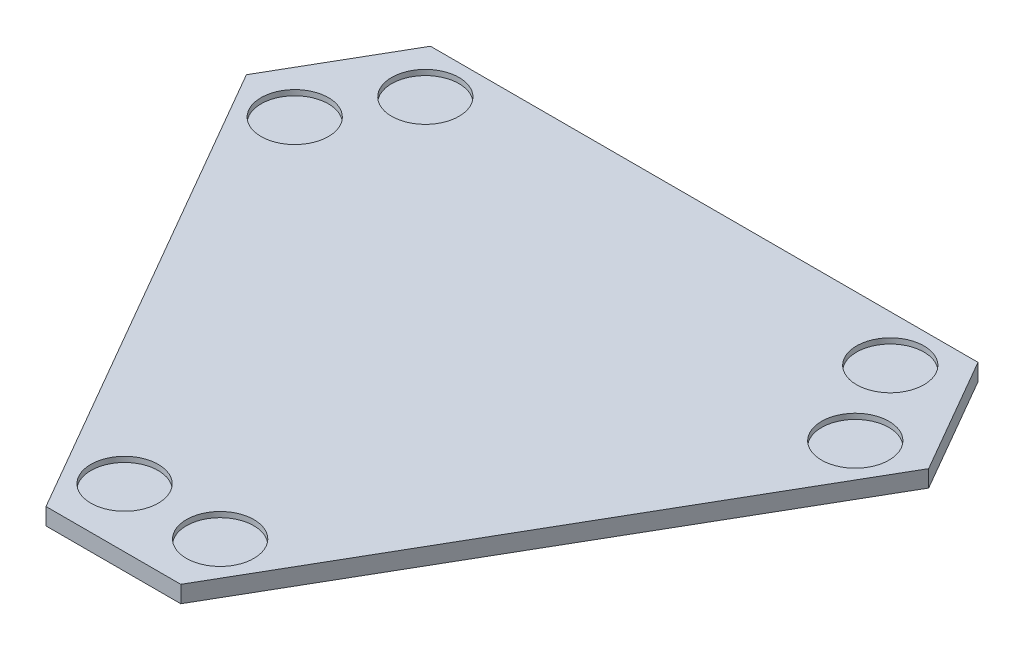
ISO-10303-21;
HEADER;
FILE_DESCRIPTION(('STEP AP214'),'2;1');
FILE_NAME('part.step','',(''),(''),'','','');
FILE_SCHEMA(('AUTOMOTIVE_DESIGN { 1 0 10303 214 1 1 1 1 }'));
ENDSEC;
DATA;
#1=APPLICATION_CONTEXT('core data for automotive mechanical design processes');
#2=APPLICATION_PROTOCOL_DEFINITION('international standard','automotive_design',2000,#1);
#3=PRODUCT_CONTEXT('',#1,'mechanical');
#4=PRODUCT('Part','Part','',(#3));
#5=PRODUCT_RELATED_PRODUCT_CATEGORY('part','',(#4));
#6=PRODUCT_DEFINITION_FORMATION('','',#4);
#7=PRODUCT_DEFINITION_CONTEXT('part definition',#1,'design');
#8=PRODUCT_DEFINITION('design','',#6,#7);
#9=PRODUCT_DEFINITION_SHAPE('','',#8);
#10=(LENGTH_UNIT() NAMED_UNIT(*) SI_UNIT(.MILLI.,.METRE.));
#11=(NAMED_UNIT(*) PLANE_ANGLE_UNIT() SI_UNIT($,.RADIAN.));
#12=(NAMED_UNIT(*) SI_UNIT($,.STERADIAN.) SOLID_ANGLE_UNIT());
#13=UNCERTAINTY_MEASURE_WITH_UNIT(LENGTH_MEASURE(1.E-05),#10,'distance_accuracy_value','');
#14=(GEOMETRIC_REPRESENTATION_CONTEXT(3) GLOBAL_UNCERTAINTY_ASSIGNED_CONTEXT((#13)) GLOBAL_UNIT_ASSIGNED_CONTEXT((#10,
#11,#12)) REPRESENTATION_CONTEXT('',''));
#15=CARTESIAN_POINT('',(0.,0.,0.));
#16=DIRECTION('',(0.,0.,1.));
#17=DIRECTION('',(1.,0.,0.));
#18=AXIS2_PLACEMENT_3D('',#15,#16,#17);
#19=CARTESIAN_POINT('',(60.6217782649107,5.,35.));
#20=DIRECTION('',(0.866025403784439,0.,0.5));
#21=DIRECTION('',(0.5,0.,-0.866025403784439));
#22=AXIS2_PLACEMENT_3D('',#19,#20,#21);
#23=PLANE('',#22);
#24=DIRECTION('',(-0.5,0.,0.866025403784439));
#25=VECTOR('',#24,1.);
#26=CARTESIAN_POINT('',(60.6217782649107,0.,35.));
#27=LINE('',#26,#25);
#28=CARTESIAN_POINT('',(101.243556529821,0.,-35.3589838486224));
#29=VERTEX_POINT('',#28);
#30=CARTESIAN_POINT('',(20.0000000000001,0.,105.358983848622));
#31=VERTEX_POINT('',#30);
#32=EDGE_CURVE('E164',#29,#31,#27,.T.);
#33=ORIENTED_EDGE('',*,*,#32,.F.);
#34=DIRECTION('',(0.,-1.,0.));
#35=VECTOR('',#34,1.);
#36=CARTESIAN_POINT('',(101.243556529821,5.,-35.3589838486224));
#37=LINE('',#36,#35);
#38=CARTESIAN_POINT('',(101.243556529821,5.,-35.3589838486224));
#39=VERTEX_POINT('',#38);
#40=EDGE_CURVE('E89',#39,#29,#37,.T.);
#41=ORIENTED_EDGE('',*,*,#40,.F.);
#42=DIRECTION('',(-0.5,0.,0.866025403784439));
#43=VECTOR('',#42,1.);
#44=CARTESIAN_POINT('',(60.6217782649107,5.,35.));
#45=LINE('',#44,#43);
#46=CARTESIAN_POINT('',(20.0000000000001,5.,105.358983848622));
#47=VERTEX_POINT('',#46);
#48=EDGE_CURVE('E394',#39,#47,#45,.T.);
#49=ORIENTED_EDGE('',*,*,#48,.T.);
#50=DIRECTION('',(0.,-1.,0.));
#51=VECTOR('',#50,1.);
#52=CARTESIAN_POINT('',(20.0000000000001,5.,105.358983848622));
#53=LINE('',#52,#51);
#54=EDGE_CURVE('E12',#47,#31,#53,.T.);
#55=ORIENTED_EDGE('',*,*,#54,.T.);
#56=EDGE_LOOP('',(#33,#41,#49,#55));
#57=FACE_BOUND('',#56,.T.);
#58=ADVANCED_FACE('F80',(#57),#23,.T.);
#59=CARTESIAN_POINT('',(91.2435565298213,5.,-52.6794919243112));
#60=DIRECTION('',(0.866025403784439,0.,-0.5));
#61=DIRECTION('',(-0.5,0.,-0.866025403784439));
#62=AXIS2_PLACEMENT_3D('',#59,#60,#61);
#63=PLANE('',#62);
#64=DIRECTION('',(0.5,0.,0.866025403784439));
#65=VECTOR('',#64,1.);
#66=CARTESIAN_POINT('',(91.2435565298213,0.,-52.6794919243112));
#67=LINE('',#66,#65);
#68=CARTESIAN_POINT('',(81.2435565298213,0.,-70.0000000000001));
#69=VERTEX_POINT('',#68);
#70=EDGE_CURVE('E168',#69,#29,#67,.T.);
#71=ORIENTED_EDGE('',*,*,#70,.F.);
#72=DIRECTION('',(0.,-1.,0.));
#73=VECTOR('',#72,1.);
#74=CARTESIAN_POINT('',(81.2435565298213,5.,-70.0000000000001));
#75=LINE('',#74,#73);
#76=CARTESIAN_POINT('',(81.2435565298213,5.,-70.0000000000001));
#77=VERTEX_POINT('',#76);
#78=EDGE_CURVE('E144',#77,#69,#75,.T.);
#79=ORIENTED_EDGE('',*,*,#78,.F.);
#80=DIRECTION('',(0.5,0.,0.866025403784439));
#81=VECTOR('',#80,1.);
#82=CARTESIAN_POINT('',(91.2435565298213,5.,-52.6794919243112));
#83=LINE('',#82,#81);
#84=EDGE_CURVE('E154',#77,#39,#83,.T.);
#85=ORIENTED_EDGE('',*,*,#84,.T.);
#86=ORIENTED_EDGE('',*,*,#40,.T.);
#87=EDGE_LOOP('',(#71,#79,#85,#86));
#88=FACE_BOUND('',#87,.T.);
#89=ADVANCED_FACE('F183',(#88),#63,.T.);
#90=CARTESIAN_POINT('',(0.,5.,-70.));
#91=DIRECTION('',(0.,0.,-1.));
#92=DIRECTION('',(-1.,0.,0.));
#93=AXIS2_PLACEMENT_3D('',#90,#91,#92);
#94=PLANE('',#93);
#95=DIRECTION('',(1.,0.,0.));
#96=VECTOR('',#95,1.);
#97=CARTESIAN_POINT('',(0.,0.,-70.));
#98=LINE('',#97,#96);
#99=CARTESIAN_POINT('',(-81.2435565298213,0.,-70.));
#100=VERTEX_POINT('',#99);
#101=EDGE_CURVE('E140',#100,#69,#98,.T.);
#102=ORIENTED_EDGE('',*,*,#101,.F.);
#103=DIRECTION('',(0.,-1.,0.));
#104=VECTOR('',#103,1.);
#105=CARTESIAN_POINT('',(-81.2435565298213,5.,-70.));
#106=LINE('',#105,#104);
#107=CARTESIAN_POINT('',(-81.2435565298213,5.,-70.));
#108=VERTEX_POINT('',#107);
#109=EDGE_CURVE('E135',#108,#100,#106,.T.);
#110=ORIENTED_EDGE('',*,*,#109,.F.);
#111=DIRECTION('',(1.,0.,0.));
#112=VECTOR('',#111,1.);
#113=CARTESIAN_POINT('',(0.,5.,-70.));
#114=LINE('',#113,#112);
#115=EDGE_CURVE('E138',#108,#77,#114,.T.);
#116=ORIENTED_EDGE('',*,*,#115,.T.);
#117=ORIENTED_EDGE('',*,*,#78,.T.);
#118=EDGE_LOOP('',(#102,#110,#116,#117));
#119=FACE_BOUND('',#118,.T.);
#120=ADVANCED_FACE('F137',(#119),#94,.T.);
#121=CARTESIAN_POINT('',(-91.2435565298214,5.,-52.6794919243112));
#122=DIRECTION('',(-0.866025403784439,0.,-0.5));
#123=DIRECTION('',(-0.5,0.,0.866025403784439));
#124=AXIS2_PLACEMENT_3D('',#121,#122,#123);
#125=PLANE('',#124);
#126=DIRECTION('',(0.5,0.,-0.866025403784439));
#127=VECTOR('',#126,1.);
#128=CARTESIAN_POINT('',(-91.2435565298214,0.,-52.6794919243112));
#129=LINE('',#128,#127);
#130=CARTESIAN_POINT('',(-101.243556529821,0.,-35.3589838486224));
#131=VERTEX_POINT('',#130);
#132=EDGE_CURVE('E172',#131,#100,#129,.T.);
#133=ORIENTED_EDGE('',*,*,#132,.F.);
#134=DIRECTION('',(0.,-1.,0.));
#135=VECTOR('',#134,1.);
#136=CARTESIAN_POINT('',(-101.243556529821,5.,-35.3589838486224));
#137=LINE('',#136,#135);
#138=CARTESIAN_POINT('',(-101.243556529821,5.,-35.3589838486224));
#139=VERTEX_POINT('',#138);
#140=EDGE_CURVE('E116',#139,#131,#137,.T.);
#141=ORIENTED_EDGE('',*,*,#140,.F.);
#142=DIRECTION('',(0.5,0.,-0.866025403784439));
#143=VECTOR('',#142,1.);
#144=CARTESIAN_POINT('',(-91.2435565298214,5.,-52.6794919243112));
#145=LINE('',#144,#143);
#146=EDGE_CURVE('E151',#139,#108,#145,.T.);
#147=ORIENTED_EDGE('',*,*,#146,.T.);
#148=ORIENTED_EDGE('',*,*,#109,.T.);
#149=EDGE_LOOP('',(#133,#141,#147,#148));
#150=FACE_BOUND('',#149,.T.);
#151=ADVANCED_FACE('F156',(#150),#125,.T.);
#152=CARTESIAN_POINT('',(-60.6217782649107,5.,35.));
#153=DIRECTION('',(-0.866025403784439,0.,0.5));
#154=DIRECTION('',(0.5,0.,0.866025403784439));
#155=AXIS2_PLACEMENT_3D('',#152,#153,#154);
#156=PLANE('',#155);
#157=DIRECTION('',(-0.5,0.,-0.866025403784439));
#158=VECTOR('',#157,1.);
#159=CARTESIAN_POINT('',(-60.6217782649107,0.,35.));
#160=LINE('',#159,#158);
#161=CARTESIAN_POINT('',(-20.0000000000001,0.,105.358983848622));
#162=VERTEX_POINT('',#161);
#163=EDGE_CURVE('E174',#162,#131,#160,.T.);
#164=ORIENTED_EDGE('',*,*,#163,.F.);
#165=DIRECTION('',(0.,-1.,0.));
#166=VECTOR('',#165,1.);
#167=CARTESIAN_POINT('',(-20.0000000000001,5.,105.358983848622));
#168=LINE('',#167,#166);
#169=CARTESIAN_POINT('',(-20.0000000000001,5.,105.358983848622));
#170=VERTEX_POINT('',#169);
#171=EDGE_CURVE('E97',#170,#162,#168,.T.);
#172=ORIENTED_EDGE('',*,*,#171,.F.);
#173=DIRECTION('',(-0.5,0.,-0.866025403784439));
#174=VECTOR('',#173,1.);
#175=CARTESIAN_POINT('',(-60.6217782649107,5.,35.));
#176=LINE('',#175,#174);
#177=EDGE_CURVE('E157',#170,#139,#176,.T.);
#178=ORIENTED_EDGE('',*,*,#177,.T.);
#179=ORIENTED_EDGE('',*,*,#140,.T.);
#180=EDGE_LOOP('',(#164,#172,#178,#179));
#181=FACE_BOUND('',#180,.T.);
#182=ADVANCED_FACE('F188',(#181),#156,.T.);
#183=CARTESIAN_POINT('',(0.,5.,105.358983848622));
#184=DIRECTION('',(0.,0.,1.));
#185=DIRECTION('',(1.,0.,0.));
#186=AXIS2_PLACEMENT_3D('',#183,#184,#185);
#187=PLANE('',#186);
#188=DIRECTION('',(-1.,0.,0.));
#189=VECTOR('',#188,1.);
#190=CARTESIAN_POINT('',(0.,0.,105.358983848622));
#191=LINE('',#190,#189);
#192=EDGE_CURVE('E162',#31,#162,#191,.T.);
#193=ORIENTED_EDGE('',*,*,#192,.F.);
#194=ORIENTED_EDGE('',*,*,#54,.F.);
#195=DIRECTION('',(-1.,0.,0.));
#196=VECTOR('',#195,1.);
#197=CARTESIAN_POINT('',(0.,5.,105.358983848622));
#198=LINE('',#197,#196);
#199=EDGE_CURVE('E177',#47,#170,#198,.T.);
#200=ORIENTED_EDGE('',*,*,#199,.T.);
#201=ORIENTED_EDGE('',*,*,#171,.T.);
#202=EDGE_LOOP('',(#193,#194,#200,#201));
#203=FACE_BOUND('',#202,.T.);
#204=ADVANCED_FACE('F82',(#203),#187,.T.);
#205=CARTESIAN_POINT('',(0.,0.,0.));
#206=DIRECTION('',(0.,1.,0.));
#207=DIRECTION('',(0.,0.,1.));
#208=AXIS2_PLACEMENT_3D('',#205,#206,#207);
#209=PLANE('',#208);
#210=ORIENTED_EDGE('',*,*,#192,.T.);
#211=ORIENTED_EDGE('',*,*,#163,.T.);
#212=ORIENTED_EDGE('',*,*,#132,.T.);
#213=ORIENTED_EDGE('',*,*,#101,.T.);
#214=ORIENTED_EDGE('',*,*,#70,.T.);
#215=ORIENTED_EDGE('',*,*,#32,.T.);
#216=EDGE_LOOP('',(#210,#211,#212,#213,#214,#215));
#217=FACE_BOUND('',#216,.T.);
#218=ADVANCED_FACE('F187',(#217),#209,.F.);
#219=CARTESIAN_POINT('',(0.,5.,0.));
#220=DIRECTION('',(0.,1.,0.));
#221=DIRECTION('',(0.,0.,1.));
#222=AXIS2_PLACEMENT_3D('',#219,#220,#221);
#223=PLANE('',#222);
#224=CARTESIAN_POINT('',(68.9946146969173,5.,-56.2157895935461));
#225=DIRECTION('',(0.,1.,0.));
#226=DIRECTION('',(0.,0.,1.));
#227=AXIS2_PLACEMENT_3D('',#224,#225,#226);
#228=CIRCLE('',#227,10.);
#229=CARTESIAN_POINT('',(68.9946146969173,5.,-46.2157895935461));
#230=VERTEX_POINT('',#229);
#231=EDGE_CURVE('E366',#230,#230,#228,.T.);
#232=ORIENTED_EDGE('',*,*,#231,.F.);
#233=EDGE_LOOP('',(#232));
#234=FACE_BOUND('',#233,.T.);
#235=CARTESIAN_POINT('',(83.181609230271,5.,-31.643194255075));
#236=DIRECTION('',(0.,1.,0.));
#237=DIRECTION('',(0.,0.,1.));
#238=AXIS2_PLACEMENT_3D('',#235,#236,#237);
#239=CIRCLE('',#238,10.);
#240=CARTESIAN_POINT('',(83.181609230271,5.,-21.643194255075));
#241=VERTEX_POINT('',#240);
#242=EDGE_CURVE('E365',#241,#241,#239,.T.);
#243=ORIENTED_EDGE('',*,*,#242,.F.);
#244=EDGE_LOOP('',(#243));
#245=FACE_BOUND('',#244,.T.);
#246=CARTESIAN_POINT('',(-83.1816092302706,5.,-31.6431942550761));
#247=DIRECTION('',(0.,1.,0.));
#248=DIRECTION('',(0.,0.,1.));
#249=AXIS2_PLACEMENT_3D('',#246,#247,#248);
#250=CIRCLE('',#249,10.);
#251=CARTESIAN_POINT('',(-83.1816092302706,5.,-21.6431942550761));
#252=VERTEX_POINT('',#251);
#253=EDGE_CURVE('E406',#252,#252,#250,.T.);
#254=ORIENTED_EDGE('',*,*,#253,.F.);
#255=EDGE_LOOP('',(#254));
#256=FACE_BOUND('',#255,.T.);
#257=CARTESIAN_POINT('',(-68.9946146969165,5.,-56.215789593547));
#258=DIRECTION('',(0.,1.,0.));
#259=DIRECTION('',(0.,0.,1.));
#260=AXIS2_PLACEMENT_3D('',#257,#258,#259);
#261=CIRCLE('',#260,10.);
#262=CARTESIAN_POINT('',(-68.9946146969165,5.,-46.215789593547));
#263=VERTEX_POINT('',#262);
#264=EDGE_CURVE('E379',#263,#263,#261,.T.);
#265=ORIENTED_EDGE('',*,*,#264,.F.);
#266=EDGE_LOOP('',(#265));
#267=FACE_BOUND('',#266,.T.);
#268=CARTESIAN_POINT('',(-14.1869945333539,5.,87.8589838486224));
#269=DIRECTION('',(0.,1.,0.));
#270=DIRECTION('',(0.,0.,1.));
#271=AXIS2_PLACEMENT_3D('',#268,#269,#270);
#272=CIRCLE('',#271,10.);
#273=CARTESIAN_POINT('',(-14.1869945333539,5.,97.8589838486225));
#274=VERTEX_POINT('',#273);
#275=EDGE_CURVE('E385',#274,#274,#272,.T.);
#276=ORIENTED_EDGE('',*,*,#275,.F.);
#277=EDGE_LOOP('',(#276));
#278=FACE_BOUND('',#277,.T.);
#279=CARTESIAN_POINT('',(14.186994533354,5.,87.8589838486224));
#280=DIRECTION('',(0.,1.,0.));
#281=DIRECTION('',(0.,0.,1.));
#282=AXIS2_PLACEMENT_3D('',#279,#280,#281);
#283=CIRCLE('',#282,10.);
#284=CARTESIAN_POINT('',(14.186994533354,5.,97.8589838486225));
#285=VERTEX_POINT('',#284);
#286=EDGE_CURVE('E388',#285,#285,#283,.T.);
#287=ORIENTED_EDGE('',*,*,#286,.F.);
#288=EDGE_LOOP('',(#287));
#289=FACE_BOUND('',#288,.T.);
#290=ORIENTED_EDGE('',*,*,#199,.F.);
#291=ORIENTED_EDGE('',*,*,#48,.F.);
#292=ORIENTED_EDGE('',*,*,#84,.F.);
#293=ORIENTED_EDGE('',*,*,#115,.F.);
#294=ORIENTED_EDGE('',*,*,#146,.F.);
#295=ORIENTED_EDGE('',*,*,#177,.F.);
#296=EDGE_LOOP('',(#290,#291,#292,#293,#294,#295));
#297=FACE_BOUND('',#296,.T.);
#298=ADVANCED_FACE('F149',(#234,#245,#256,#267,#278,#289,#297),#223,.T.);
#299=CARTESIAN_POINT('',(14.186994533354,3.4,87.8589838486224));
#300=DIRECTION('',(0.,1.,0.));
#301=DIRECTION('',(0.,0.,1.));
#302=AXIS2_PLACEMENT_3D('',#299,#300,#301);
#303=CYLINDRICAL_SURFACE('',#302,10.);
#304=CARTESIAN_POINT('',(14.186994533354,3.4,87.8589838486224));
#305=DIRECTION('',(0.,1.,0.));
#306=DIRECTION('',(0.,0.,1.));
#307=AXIS2_PLACEMENT_3D('',#304,#305,#306);
#308=CIRCLE('',#307,10.);
#309=CARTESIAN_POINT('',(14.186994533354,3.4,97.8589838486225));
#310=VERTEX_POINT('',#309);
#311=EDGE_CURVE('E378',#310,#310,#308,.T.);
#312=ORIENTED_EDGE('',*,*,#311,.F.);
#313=EDGE_LOOP('',(#312));
#314=FACE_BOUND('',#313,.T.);
#315=ORIENTED_EDGE('',*,*,#286,.T.);
#316=EDGE_LOOP('',(#315));
#317=FACE_BOUND('',#316,.T.);
#318=ADVANCED_FACE('F236',(#314,#317),#303,.F.);
#319=CARTESIAN_POINT('',(14.186994533354,3.4,87.8589838486224));
#320=DIRECTION('',(0.,1.,0.));
#321=DIRECTION('',(0.,0.,1.));
#322=AXIS2_PLACEMENT_3D('',#319,#320,#321);
#323=PLANE('',#322);
#324=ORIENTED_EDGE('',*,*,#311,.T.);
#325=EDGE_LOOP('',(#324));
#326=FACE_BOUND('',#325,.T.);
#327=ADVANCED_FACE('F241',(#326),#323,.T.);
#328=CARTESIAN_POINT('',(-14.1869945333539,3.4,87.8589838486224));
#329=DIRECTION('',(0.,1.,0.));
#330=DIRECTION('',(0.,0.,1.));
#331=AXIS2_PLACEMENT_3D('',#328,#329,#330);
#332=CYLINDRICAL_SURFACE('',#331,10.);
#333=CARTESIAN_POINT('',(-14.1869945333539,3.4,87.8589838486224));
#334=DIRECTION('',(0.,1.,0.));
#335=DIRECTION('',(0.,0.,1.));
#336=AXIS2_PLACEMENT_3D('',#333,#334,#335);
#337=CIRCLE('',#336,10.);
#338=CARTESIAN_POINT('',(-14.1869945333539,3.4,97.8589838486225));
#339=VERTEX_POINT('',#338);
#340=EDGE_CURVE('E165',#339,#339,#337,.T.);
#341=ORIENTED_EDGE('',*,*,#340,.F.);
#342=EDGE_LOOP('',(#341));
#343=FACE_BOUND('',#342,.T.);
#344=ORIENTED_EDGE('',*,*,#275,.T.);
#345=EDGE_LOOP('',(#344));
#346=FACE_BOUND('',#345,.T.);
#347=ADVANCED_FACE('F251',(#343,#346),#332,.F.);
#348=CARTESIAN_POINT('',(-14.1869945333539,3.4,87.8589838486224));
#349=DIRECTION('',(0.,1.,0.));
#350=DIRECTION('',(0.,0.,1.));
#351=AXIS2_PLACEMENT_3D('',#348,#349,#350);
#352=PLANE('',#351);
#353=ORIENTED_EDGE('',*,*,#340,.T.);
#354=EDGE_LOOP('',(#353));
#355=FACE_BOUND('',#354,.T.);
#356=ADVANCED_FACE('F261',(#355),#352,.T.);
#357=CARTESIAN_POINT('',(-68.9946146969165,3.4,-56.215789593547));
#358=DIRECTION('',(0.,1.,0.));
#359=DIRECTION('',(0.,0.,1.));
#360=AXIS2_PLACEMENT_3D('',#357,#358,#359);
#361=CYLINDRICAL_SURFACE('',#360,10.);
#362=CARTESIAN_POINT('',(-68.9946146969165,3.4,-56.215789593547));
#363=DIRECTION('',(0.,1.,0.));
#364=DIRECTION('',(0.,0.,1.));
#365=AXIS2_PLACEMENT_3D('',#362,#363,#364);
#366=CIRCLE('',#365,10.);
#367=CARTESIAN_POINT('',(-68.9946146969165,3.4,-46.215789593547));
#368=VERTEX_POINT('',#367);
#369=EDGE_CURVE('E375',#368,#368,#366,.T.);
#370=ORIENTED_EDGE('',*,*,#369,.F.);
#371=EDGE_LOOP('',(#370));
#372=FACE_BOUND('',#371,.T.);
#373=ORIENTED_EDGE('',*,*,#264,.T.);
#374=EDGE_LOOP('',(#373));
#375=FACE_BOUND('',#374,.T.);
#376=ADVANCED_FACE('F271',(#372,#375),#361,.F.);
#377=CARTESIAN_POINT('',(-68.9946146969165,3.4,-56.215789593547));
#378=DIRECTION('',(0.,1.,0.));
#379=DIRECTION('',(0.,0.,1.));
#380=AXIS2_PLACEMENT_3D('',#377,#378,#379);
#381=PLANE('',#380);
#382=ORIENTED_EDGE('',*,*,#369,.T.);
#383=EDGE_LOOP('',(#382));
#384=FACE_BOUND('',#383,.T.);
#385=ADVANCED_FACE('F288',(#384),#381,.T.);
#386=CARTESIAN_POINT('',(-83.1816092302706,3.4,-31.6431942550761));
#387=DIRECTION('',(0.,1.,0.));
#388=DIRECTION('',(0.,0.,1.));
#389=AXIS2_PLACEMENT_3D('',#386,#387,#388);
#390=CYLINDRICAL_SURFACE('',#389,10.);
#391=CARTESIAN_POINT('',(-83.1816092302706,3.4,-31.6431942550761));
#392=DIRECTION('',(0.,1.,0.));
#393=DIRECTION('',(0.,0.,1.));
#394=AXIS2_PLACEMENT_3D('',#391,#392,#393);
#395=CIRCLE('',#394,10.);
#396=CARTESIAN_POINT('',(-83.1816092302706,3.4,-21.6431942550761));
#397=VERTEX_POINT('',#396);
#398=EDGE_CURVE('E382',#397,#397,#395,.T.);
#399=ORIENTED_EDGE('',*,*,#398,.F.);
#400=EDGE_LOOP('',(#399));
#401=FACE_BOUND('',#400,.T.);
#402=ORIENTED_EDGE('',*,*,#253,.T.);
#403=EDGE_LOOP('',(#402));
#404=FACE_BOUND('',#403,.T.);
#405=ADVANCED_FACE('F298',(#401,#404),#390,.F.);
#406=CARTESIAN_POINT('',(-83.1816092302706,3.4,-31.6431942550761));
#407=DIRECTION('',(0.,1.,0.));
#408=DIRECTION('',(0.,0.,1.));
#409=AXIS2_PLACEMENT_3D('',#406,#407,#408);
#410=PLANE('',#409);
#411=ORIENTED_EDGE('',*,*,#398,.T.);
#412=EDGE_LOOP('',(#411));
#413=FACE_BOUND('',#412,.T.);
#414=ADVANCED_FACE('F308',(#413),#410,.T.);
#415=CARTESIAN_POINT('',(83.181609230271,3.4,-31.643194255075));
#416=DIRECTION('',(0.,1.,0.));
#417=DIRECTION('',(0.,0.,1.));
#418=AXIS2_PLACEMENT_3D('',#415,#416,#417);
#419=CYLINDRICAL_SURFACE('',#418,10.);
#420=CARTESIAN_POINT('',(83.181609230271,3.4,-31.643194255075));
#421=DIRECTION('',(0.,1.,0.));
#422=DIRECTION('',(0.,0.,1.));
#423=AXIS2_PLACEMENT_3D('',#420,#421,#422);
#424=CIRCLE('',#423,10.);
#425=CARTESIAN_POINT('',(83.181609230271,3.4,-21.643194255075));
#426=VERTEX_POINT('',#425);
#427=EDGE_CURVE('E369',#426,#426,#424,.T.);
#428=ORIENTED_EDGE('',*,*,#427,.F.);
#429=EDGE_LOOP('',(#428));
#430=FACE_BOUND('',#429,.T.);
#431=ORIENTED_EDGE('',*,*,#242,.T.);
#432=EDGE_LOOP('',(#431));
#433=FACE_BOUND('',#432,.T.);
#434=ADVANCED_FACE('F318',(#430,#433),#419,.F.);
#435=CARTESIAN_POINT('',(83.181609230271,3.4,-31.643194255075));
#436=DIRECTION('',(0.,1.,0.));
#437=DIRECTION('',(0.,0.,1.));
#438=AXIS2_PLACEMENT_3D('',#435,#436,#437);
#439=PLANE('',#438);
#440=ORIENTED_EDGE('',*,*,#427,.T.);
#441=EDGE_LOOP('',(#440));
#442=FACE_BOUND('',#441,.T.);
#443=ADVANCED_FACE('F328',(#442),#439,.T.);
#444=CARTESIAN_POINT('',(68.9946146969173,3.4,-56.2157895935461));
#445=DIRECTION('',(0.,1.,0.));
#446=DIRECTION('',(0.,0.,1.));
#447=AXIS2_PLACEMENT_3D('',#444,#445,#446);
#448=CYLINDRICAL_SURFACE('',#447,10.);
#449=CARTESIAN_POINT('',(68.9946146969173,3.4,-56.2157895935461));
#450=DIRECTION('',(0.,1.,0.));
#451=DIRECTION('',(0.,0.,1.));
#452=AXIS2_PLACEMENT_3D('',#449,#450,#451);
#453=CIRCLE('',#452,10.);
#454=CARTESIAN_POINT('',(68.9946146969173,3.4,-46.2157895935461));
#455=VERTEX_POINT('',#454);
#456=EDGE_CURVE('E364',#455,#455,#453,.T.);
#457=ORIENTED_EDGE('',*,*,#456,.F.);
#458=EDGE_LOOP('',(#457));
#459=FACE_BOUND('',#458,.T.);
#460=ORIENTED_EDGE('',*,*,#231,.T.);
#461=EDGE_LOOP('',(#460));
#462=FACE_BOUND('',#461,.T.);
#463=ADVANCED_FACE('F338',(#459,#462),#448,.F.);
#464=CARTESIAN_POINT('',(68.9946146969173,3.4,-56.2157895935461));
#465=DIRECTION('',(0.,1.,0.));
#466=DIRECTION('',(0.,0.,1.));
#467=AXIS2_PLACEMENT_3D('',#464,#465,#466);
#468=PLANE('',#467);
#469=ORIENTED_EDGE('',*,*,#456,.T.);
#470=EDGE_LOOP('',(#469));
#471=FACE_BOUND('',#470,.T.);
#472=ADVANCED_FACE('F348',(#471),#468,.T.);
#473=CLOSED_SHELL('',(#58,#89,#120,#151,#182,#204,#218,#298,#318,#327,#347,#356,#376,#385,#405,
#414,#434,#443,#463,#472));
#474=MANIFOLD_SOLID_BREP('B2',#473);
#475=ADVANCED_BREP_SHAPE_REPRESENTATION('',(#18,#474),#14);
#476=SHAPE_DEFINITION_REPRESENTATION(#9,#475);
ENDSEC;
END-ISO-10303-21;
